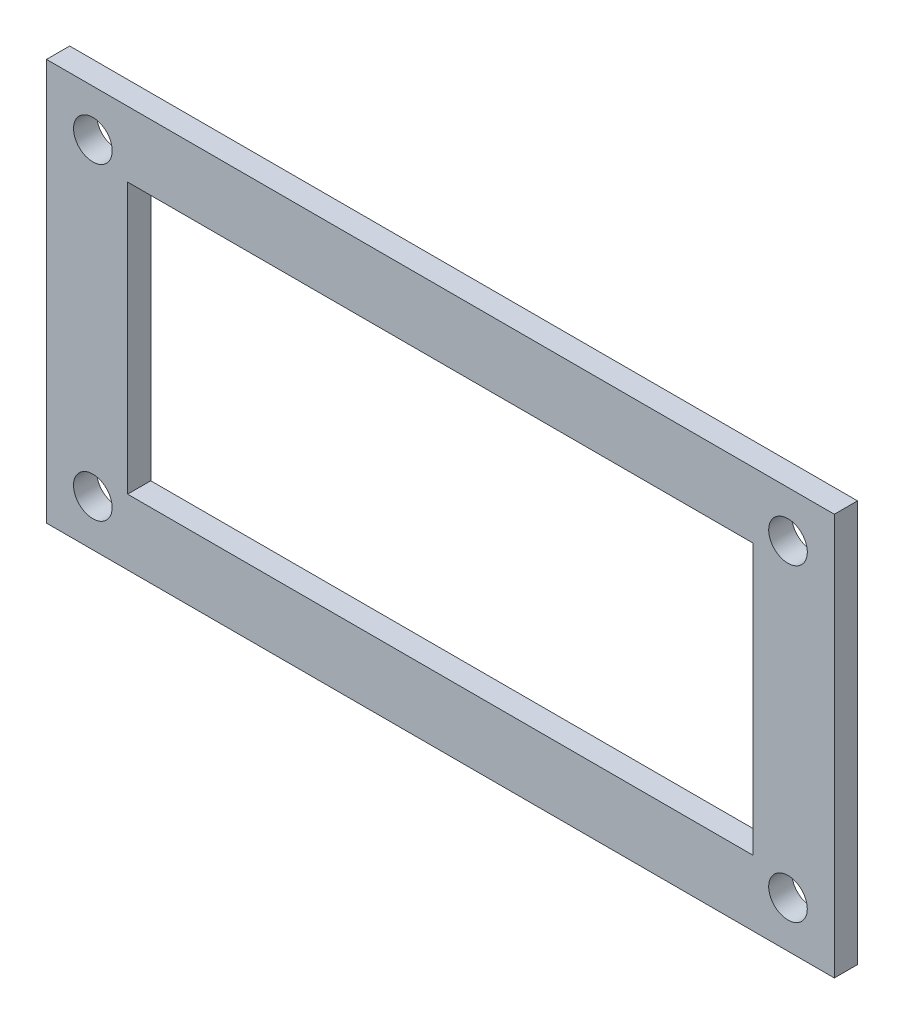
ISO-10303-21;
HEADER;
FILE_DESCRIPTION(('STEP AP214'),'2;1');
FILE_NAME('part.step','',(''),(''),'','','');
FILE_SCHEMA(('AUTOMOTIVE_DESIGN { 1 0 10303 214 1 1 1 1 }'));
ENDSEC;
DATA;
#1=APPLICATION_CONTEXT('core data for automotive mechanical design processes');
#2=APPLICATION_PROTOCOL_DEFINITION('international standard','automotive_design',2000,#1);
#3=PRODUCT_CONTEXT('',#1,'mechanical');
#4=PRODUCT('Part','Part','',(#3));
#5=PRODUCT_RELATED_PRODUCT_CATEGORY('part','',(#4));
#6=PRODUCT_DEFINITION_FORMATION('','',#4);
#7=PRODUCT_DEFINITION_CONTEXT('part definition',#1,'design');
#8=PRODUCT_DEFINITION('design','',#6,#7);
#9=PRODUCT_DEFINITION_SHAPE('','',#8);
#10=(LENGTH_UNIT() NAMED_UNIT(*) SI_UNIT(.MILLI.,.METRE.));
#11=(NAMED_UNIT(*) PLANE_ANGLE_UNIT() SI_UNIT($,.RADIAN.));
#12=(NAMED_UNIT(*) SI_UNIT($,.STERADIAN.) SOLID_ANGLE_UNIT());
#13=UNCERTAINTY_MEASURE_WITH_UNIT(LENGTH_MEASURE(1.E-05),#10,'distance_accuracy_value','');
#14=(GEOMETRIC_REPRESENTATION_CONTEXT(3) GLOBAL_UNCERTAINTY_ASSIGNED_CONTEXT((#13)) GLOBAL_UNIT_ASSIGNED_CONTEXT((#10,
#11,#12)) REPRESENTATION_CONTEXT('',''));
#15=CARTESIAN_POINT('',(0.,0.,0.));
#16=DIRECTION('',(0.,0.,1.));
#17=DIRECTION('',(1.,0.,0.));
#18=AXIS2_PLACEMENT_3D('',#15,#16,#17);
#19=CARTESIAN_POINT('',(0.,0.,3.));
#20=DIRECTION('',(0.,0.,-1.));
#21=DIRECTION('',(-1.,0.,0.));
#22=AXIS2_PLACEMENT_3D('',#19,#20,#21);
#23=PLANE('',#22);
#24=DIRECTION('',(0.,1.,0.));
#25=VECTOR('',#24,1.);
#26=CARTESIAN_POINT('',(51.,-26.,3.));
#27=LINE('',#26,#25);
#28=CARTESIAN_POINT('',(51.,-26.,3.));
#29=VERTEX_POINT('',#28);
#30=CARTESIAN_POINT('',(51.,26.,3.));
#31=VERTEX_POINT('',#30);
#32=EDGE_CURVE('E137',#29,#31,#27,.T.);
#33=ORIENTED_EDGE('',*,*,#32,.T.);
#34=DIRECTION('',(-1.,0.,0.));
#35=VECTOR('',#34,1.);
#36=CARTESIAN_POINT('',(-51.,26.,3.));
#37=LINE('',#36,#35);
#38=CARTESIAN_POINT('',(-51.,26.,3.));
#39=VERTEX_POINT('',#38);
#40=EDGE_CURVE('E140',#31,#39,#37,.T.);
#41=ORIENTED_EDGE('',*,*,#40,.T.);
#42=DIRECTION('',(0.,-1.,0.));
#43=VECTOR('',#42,1.);
#44=CARTESIAN_POINT('',(-51.,-26.,3.));
#45=LINE('',#44,#43);
#46=CARTESIAN_POINT('',(-51.,-26.,3.));
#47=VERTEX_POINT('',#46);
#48=EDGE_CURVE('E143',#39,#47,#45,.T.);
#49=ORIENTED_EDGE('',*,*,#48,.T.);
#50=DIRECTION('',(1.,0.,0.));
#51=VECTOR('',#50,1.);
#52=CARTESIAN_POINT('',(-51.,-26.,3.));
#53=LINE('',#52,#51);
#54=EDGE_CURVE('E145',#47,#29,#53,.T.);
#55=ORIENTED_EDGE('',*,*,#54,.T.);
#56=EDGE_LOOP('',(#33,#41,#49,#55));
#57=FACE_BOUND('',#56,.T.);
#58=DIRECTION('',(0.,1.,0.));
#59=VECTOR('',#58,1.);
#60=CARTESIAN_POINT('',(40.5,-17.5,3.));
#61=LINE('',#60,#59);
#62=CARTESIAN_POINT('',(40.5,-17.5,3.));
#63=VERTEX_POINT('',#62);
#64=CARTESIAN_POINT('',(40.5,17.5,3.));
#65=VERTEX_POINT('',#64);
#66=EDGE_CURVE('E98',#63,#65,#61,.T.);
#67=ORIENTED_EDGE('',*,*,#66,.F.);
#68=DIRECTION('',(1.,0.,0.));
#69=VECTOR('',#68,1.);
#70=CARTESIAN_POINT('',(-40.5,-17.5,3.));
#71=LINE('',#70,#69);
#72=CARTESIAN_POINT('',(-40.5,-17.5,3.));
#73=VERTEX_POINT('',#72);
#74=EDGE_CURVE('E121',#73,#63,#71,.T.);
#75=ORIENTED_EDGE('',*,*,#74,.F.);
#76=DIRECTION('',(0.,-1.,0.));
#77=VECTOR('',#76,1.);
#78=CARTESIAN_POINT('',(-40.5,-17.5,3.));
#79=LINE('',#78,#77);
#80=CARTESIAN_POINT('',(-40.5,17.5,3.));
#81=VERTEX_POINT('',#80);
#82=EDGE_CURVE('E119',#81,#73,#79,.T.);
#83=ORIENTED_EDGE('',*,*,#82,.F.);
#84=DIRECTION('',(-1.,0.,0.));
#85=VECTOR('',#84,1.);
#86=CARTESIAN_POINT('',(-40.5,17.5,3.));
#87=LINE('',#86,#85);
#88=EDGE_CURVE('E106',#65,#81,#87,.T.);
#89=ORIENTED_EDGE('',*,*,#88,.F.);
#90=EDGE_LOOP('',(#67,#75,#83,#89));
#91=FACE_BOUND('',#90,.T.);
#92=CARTESIAN_POINT('',(-45.,20.,3.));
#93=DIRECTION('',(0.,0.,1.));
#94=DIRECTION('',(1.,0.,0.));
#95=AXIS2_PLACEMENT_3D('',#92,#93,#94);
#96=CIRCLE('',#95,2.5);
#97=CARTESIAN_POINT('',(-42.5,20.,3.));
#98=VERTEX_POINT('',#97);
#99=EDGE_CURVE('E127',#98,#98,#96,.T.);
#100=ORIENTED_EDGE('',*,*,#99,.F.);
#101=EDGE_LOOP('',(#100));
#102=FACE_BOUND('',#101,.T.);
#103=CARTESIAN_POINT('',(-45.,-20.,3.));
#104=DIRECTION('',(0.,0.,1.));
#105=DIRECTION('',(-1.,0.,0.));
#106=AXIS2_PLACEMENT_3D('',#103,#104,#105);
#107=CIRCLE('',#106,2.49999999999999);
#108=CARTESIAN_POINT('',(-47.5,-20.,3.));
#109=VERTEX_POINT('',#108);
#110=EDGE_CURVE('E249',#109,#109,#107,.T.);
#111=ORIENTED_EDGE('',*,*,#110,.F.);
#112=EDGE_LOOP('',(#111));
#113=FACE_BOUND('',#112,.T.);
#114=CARTESIAN_POINT('',(45.,-20.,3.));
#115=DIRECTION('',(0.,0.,1.));
#116=DIRECTION('',(1.,0.,0.));
#117=AXIS2_PLACEMENT_3D('',#114,#115,#116);
#118=CIRCLE('',#117,2.49999999999999);
#119=CARTESIAN_POINT('',(47.5,-20.,3.));
#120=VERTEX_POINT('',#119);
#121=EDGE_CURVE('E243',#120,#120,#118,.T.);
#122=ORIENTED_EDGE('',*,*,#121,.F.);
#123=EDGE_LOOP('',(#122));
#124=FACE_BOUND('',#123,.T.);
#125=CARTESIAN_POINT('',(45.,20.,3.));
#126=DIRECTION('',(0.,0.,1.));
#127=DIRECTION('',(-1.,0.,0.));
#128=AXIS2_PLACEMENT_3D('',#125,#126,#127);
#129=CIRCLE('',#128,2.5);
#130=CARTESIAN_POINT('',(42.5,20.,3.));
#131=VERTEX_POINT('',#130);
#132=EDGE_CURVE('E234',#131,#131,#129,.T.);
#133=ORIENTED_EDGE('',*,*,#132,.F.);
#134=EDGE_LOOP('',(#133));
#135=FACE_BOUND('',#134,.T.);
#136=ADVANCED_FACE('F33',(#57,#91,#102,#113,#124,#135),#23,.F.);
#137=CARTESIAN_POINT('',(0.,0.,0.));
#138=DIRECTION('',(0.,0.,-1.));
#139=DIRECTION('',(-1.,0.,0.));
#140=AXIS2_PLACEMENT_3D('',#137,#138,#139);
#141=PLANE('',#140);
#142=CARTESIAN_POINT('',(45.,-20.,0.));
#143=DIRECTION('',(0.,0.,1.));
#144=DIRECTION('',(1.,0.,0.));
#145=AXIS2_PLACEMENT_3D('',#142,#143,#144);
#146=CIRCLE('',#145,2.49999999999999);
#147=CARTESIAN_POINT('',(47.5,-20.,0.));
#148=VERTEX_POINT('',#147);
#149=EDGE_CURVE('E240',#148,#148,#146,.T.);
#150=ORIENTED_EDGE('',*,*,#149,.T.);
#151=EDGE_LOOP('',(#150));
#152=FACE_BOUND('',#151,.T.);
#153=CARTESIAN_POINT('',(-45.,20.,0.));
#154=DIRECTION('',(0.,0.,1.));
#155=DIRECTION('',(1.,0.,0.));
#156=AXIS2_PLACEMENT_3D('',#153,#154,#155);
#157=CIRCLE('',#156,2.5);
#158=CARTESIAN_POINT('',(-42.5,20.,0.));
#159=VERTEX_POINT('',#158);
#160=EDGE_CURVE('E252',#159,#159,#157,.T.);
#161=ORIENTED_EDGE('',*,*,#160,.T.);
#162=EDGE_LOOP('',(#161));
#163=FACE_BOUND('',#162,.T.);
#164=DIRECTION('',(0.,1.,0.));
#165=VECTOR('',#164,1.);
#166=CARTESIAN_POINT('',(51.,-26.,0.));
#167=LINE('',#166,#165);
#168=CARTESIAN_POINT('',(51.,-26.,0.));
#169=VERTEX_POINT('',#168);
#170=CARTESIAN_POINT('',(51.,26.,0.));
#171=VERTEX_POINT('',#170);
#172=EDGE_CURVE('E114',#169,#171,#167,.T.);
#173=ORIENTED_EDGE('',*,*,#172,.F.);
#174=DIRECTION('',(1.,0.,0.));
#175=VECTOR('',#174,1.);
#176=CARTESIAN_POINT('',(-51.,-26.,0.));
#177=LINE('',#176,#175);
#178=CARTESIAN_POINT('',(-51.,-26.,0.));
#179=VERTEX_POINT('',#178);
#180=EDGE_CURVE('E141',#179,#169,#177,.T.);
#181=ORIENTED_EDGE('',*,*,#180,.F.);
#182=DIRECTION('',(0.,-1.,0.));
#183=VECTOR('',#182,1.);
#184=CARTESIAN_POINT('',(-51.,-26.,0.));
#185=LINE('',#184,#183);
#186=CARTESIAN_POINT('',(-51.,26.,0.));
#187=VERTEX_POINT('',#186);
#188=EDGE_CURVE('E152',#187,#179,#185,.T.);
#189=ORIENTED_EDGE('',*,*,#188,.F.);
#190=DIRECTION('',(-1.,0.,0.));
#191=VECTOR('',#190,1.);
#192=CARTESIAN_POINT('',(-51.,26.,0.));
#193=LINE('',#192,#191);
#194=EDGE_CURVE('E150',#171,#187,#193,.T.);
#195=ORIENTED_EDGE('',*,*,#194,.F.);
#196=EDGE_LOOP('',(#173,#181,#189,#195));
#197=FACE_BOUND('',#196,.T.);
#198=DIRECTION('',(1.,0.,0.));
#199=VECTOR('',#198,1.);
#200=CARTESIAN_POINT('',(-40.5,-17.5,0.));
#201=LINE('',#200,#199);
#202=CARTESIAN_POINT('',(-40.5,-17.5,0.));
#203=VERTEX_POINT('',#202);
#204=CARTESIAN_POINT('',(40.5,-17.5,0.));
#205=VERTEX_POINT('',#204);
#206=EDGE_CURVE('E107',#203,#205,#201,.T.);
#207=ORIENTED_EDGE('',*,*,#206,.T.);
#208=DIRECTION('',(0.,1.,0.));
#209=VECTOR('',#208,1.);
#210=CARTESIAN_POINT('',(40.5,-17.5,0.));
#211=LINE('',#210,#209);
#212=CARTESIAN_POINT('',(40.5,17.5,0.));
#213=VERTEX_POINT('',#212);
#214=EDGE_CURVE('E56',#205,#213,#211,.T.);
#215=ORIENTED_EDGE('',*,*,#214,.T.);
#216=DIRECTION('',(-1.,0.,0.));
#217=VECTOR('',#216,1.);
#218=CARTESIAN_POINT('',(-40.5,17.5,0.));
#219=LINE('',#218,#217);
#220=CARTESIAN_POINT('',(-40.5,17.5,0.));
#221=VERTEX_POINT('',#220);
#222=EDGE_CURVE('E113',#213,#221,#219,.T.);
#223=ORIENTED_EDGE('',*,*,#222,.T.);
#224=DIRECTION('',(0.,-1.,0.));
#225=VECTOR('',#224,1.);
#226=CARTESIAN_POINT('',(-40.5,-17.5,0.));
#227=LINE('',#226,#225);
#228=EDGE_CURVE('E129',#221,#203,#227,.T.);
#229=ORIENTED_EDGE('',*,*,#228,.T.);
#230=EDGE_LOOP('',(#207,#215,#223,#229));
#231=FACE_BOUND('',#230,.T.);
#232=CARTESIAN_POINT('',(-45.,-20.,0.));
#233=DIRECTION('',(0.,0.,1.));
#234=DIRECTION('',(-1.,0.,0.));
#235=AXIS2_PLACEMENT_3D('',#232,#233,#234);
#236=CIRCLE('',#235,2.49999999999999);
#237=CARTESIAN_POINT('',(-47.5,-20.,0.));
#238=VERTEX_POINT('',#237);
#239=EDGE_CURVE('E246',#238,#238,#236,.T.);
#240=ORIENTED_EDGE('',*,*,#239,.T.);
#241=EDGE_LOOP('',(#240));
#242=FACE_BOUND('',#241,.T.);
#243=CARTESIAN_POINT('',(45.,20.,0.));
#244=DIRECTION('',(0.,0.,1.));
#245=DIRECTION('',(-1.,0.,0.));
#246=AXIS2_PLACEMENT_3D('',#243,#244,#245);
#247=CIRCLE('',#246,2.5);
#248=CARTESIAN_POINT('',(42.5,20.,0.));
#249=VERTEX_POINT('',#248);
#250=EDGE_CURVE('E237',#249,#249,#247,.T.);
#251=ORIENTED_EDGE('',*,*,#250,.T.);
#252=EDGE_LOOP('',(#251));
#253=FACE_BOUND('',#252,.T.);
#254=ADVANCED_FACE('F170',(#152,#163,#197,#231,#242,#253),#141,.T.);
#255=CARTESIAN_POINT('',(51.,-26.,3.));
#256=DIRECTION('',(-1.,0.,0.));
#257=DIRECTION('',(0.,0.,1.));
#258=AXIS2_PLACEMENT_3D('',#255,#256,#257);
#259=PLANE('',#258);
#260=ORIENTED_EDGE('',*,*,#172,.T.);
#261=DIRECTION('',(0.,0.,-1.));
#262=VECTOR('',#261,1.);
#263=CARTESIAN_POINT('',(51.,26.,3.));
#264=LINE('',#263,#262);
#265=EDGE_CURVE('E11',#31,#171,#264,.T.);
#266=ORIENTED_EDGE('',*,*,#265,.F.);
#267=ORIENTED_EDGE('',*,*,#32,.F.);
#268=DIRECTION('',(0.,0.,-1.));
#269=VECTOR('',#268,1.);
#270=CARTESIAN_POINT('',(51.,-26.,3.));
#271=LINE('',#270,#269);
#272=EDGE_CURVE('E147',#29,#169,#271,.T.);
#273=ORIENTED_EDGE('',*,*,#272,.T.);
#274=EDGE_LOOP('',(#260,#266,#267,#273));
#275=FACE_BOUND('',#274,.T.);
#276=ADVANCED_FACE('F35',(#275),#259,.F.);
#277=CARTESIAN_POINT('',(-51.,26.,3.));
#278=DIRECTION('',(0.,-1.,0.));
#279=DIRECTION('',(0.,0.,-1.));
#280=AXIS2_PLACEMENT_3D('',#277,#278,#279);
#281=PLANE('',#280);
#282=ORIENTED_EDGE('',*,*,#194,.T.);
#283=DIRECTION('',(0.,0.,-1.));
#284=VECTOR('',#283,1.);
#285=CARTESIAN_POINT('',(-51.,26.,3.));
#286=LINE('',#285,#284);
#287=EDGE_CURVE('E41',#39,#187,#286,.T.);
#288=ORIENTED_EDGE('',*,*,#287,.F.);
#289=ORIENTED_EDGE('',*,*,#40,.F.);
#290=ORIENTED_EDGE('',*,*,#265,.T.);
#291=EDGE_LOOP('',(#282,#288,#289,#290));
#292=FACE_BOUND('',#291,.T.);
#293=ADVANCED_FACE('F180',(#292),#281,.F.);
#294=CARTESIAN_POINT('',(-51.,-26.,3.));
#295=DIRECTION('',(1.,0.,0.));
#296=DIRECTION('',(0.,0.,-1.));
#297=AXIS2_PLACEMENT_3D('',#294,#295,#296);
#298=PLANE('',#297);
#299=ORIENTED_EDGE('',*,*,#188,.T.);
#300=DIRECTION('',(0.,0.,-1.));
#301=VECTOR('',#300,1.);
#302=CARTESIAN_POINT('',(-51.,-26.,3.));
#303=LINE('',#302,#301);
#304=EDGE_CURVE('E157',#47,#179,#303,.T.);
#305=ORIENTED_EDGE('',*,*,#304,.F.);
#306=ORIENTED_EDGE('',*,*,#48,.F.);
#307=ORIENTED_EDGE('',*,*,#287,.T.);
#308=EDGE_LOOP('',(#299,#305,#306,#307));
#309=FACE_BOUND('',#308,.T.);
#310=ADVANCED_FACE('F164',(#309),#298,.F.);
#311=CARTESIAN_POINT('',(-51.,-26.,3.));
#312=DIRECTION('',(0.,1.,0.));
#313=DIRECTION('',(0.,0.,1.));
#314=AXIS2_PLACEMENT_3D('',#311,#312,#313);
#315=PLANE('',#314);
#316=ORIENTED_EDGE('',*,*,#180,.T.);
#317=ORIENTED_EDGE('',*,*,#272,.F.);
#318=ORIENTED_EDGE('',*,*,#54,.F.);
#319=ORIENTED_EDGE('',*,*,#304,.T.);
#320=EDGE_LOOP('',(#316,#317,#318,#319));
#321=FACE_BOUND('',#320,.T.);
#322=ADVANCED_FACE('F174',(#321),#315,.F.);
#323=CARTESIAN_POINT('',(40.5,-17.5,3.));
#324=DIRECTION('',(-1.,0.,0.));
#325=DIRECTION('',(0.,0.,1.));
#326=AXIS2_PLACEMENT_3D('',#323,#324,#325);
#327=PLANE('',#326);
#328=ORIENTED_EDGE('',*,*,#214,.F.);
#329=DIRECTION('',(0.,0.,-1.));
#330=VECTOR('',#329,1.);
#331=CARTESIAN_POINT('',(40.5,-17.5,3.));
#332=LINE('',#331,#330);
#333=EDGE_CURVE('E102',#63,#205,#332,.T.);
#334=ORIENTED_EDGE('',*,*,#333,.F.);
#335=ORIENTED_EDGE('',*,*,#66,.T.);
#336=DIRECTION('',(0.,0.,-1.));
#337=VECTOR('',#336,1.);
#338=CARTESIAN_POINT('',(40.5,17.5,3.));
#339=LINE('',#338,#337);
#340=EDGE_CURVE('E101',#65,#213,#339,.T.);
#341=ORIENTED_EDGE('',*,*,#340,.T.);
#342=EDGE_LOOP('',(#328,#334,#335,#341));
#343=FACE_BOUND('',#342,.T.);
#344=ADVANCED_FACE('F100',(#343),#327,.T.);
#345=CARTESIAN_POINT('',(-40.5,17.5,3.));
#346=DIRECTION('',(0.,-1.,0.));
#347=DIRECTION('',(0.,0.,-1.));
#348=AXIS2_PLACEMENT_3D('',#345,#346,#347);
#349=PLANE('',#348);
#350=ORIENTED_EDGE('',*,*,#222,.F.);
#351=ORIENTED_EDGE('',*,*,#340,.F.);
#352=ORIENTED_EDGE('',*,*,#88,.T.);
#353=DIRECTION('',(0.,0.,-1.));
#354=VECTOR('',#353,1.);
#355=CARTESIAN_POINT('',(-40.5,17.5,3.));
#356=LINE('',#355,#354);
#357=EDGE_CURVE('E115',#81,#221,#356,.T.);
#358=ORIENTED_EDGE('',*,*,#357,.T.);
#359=EDGE_LOOP('',(#350,#351,#352,#358));
#360=FACE_BOUND('',#359,.T.);
#361=ADVANCED_FACE('F110',(#360),#349,.T.);
#362=CARTESIAN_POINT('',(-40.5,-17.5,3.));
#363=DIRECTION('',(1.,0.,0.));
#364=DIRECTION('',(0.,0.,-1.));
#365=AXIS2_PLACEMENT_3D('',#362,#363,#364);
#366=PLANE('',#365);
#367=ORIENTED_EDGE('',*,*,#228,.F.);
#368=ORIENTED_EDGE('',*,*,#357,.F.);
#369=ORIENTED_EDGE('',*,*,#82,.T.);
#370=DIRECTION('',(0.,0.,-1.));
#371=VECTOR('',#370,1.);
#372=CARTESIAN_POINT('',(-40.5,-17.5,3.));
#373=LINE('',#372,#371);
#374=EDGE_CURVE('E48',#73,#203,#373,.T.);
#375=ORIENTED_EDGE('',*,*,#374,.T.);
#376=EDGE_LOOP('',(#367,#368,#369,#375));
#377=FACE_BOUND('',#376,.T.);
#378=ADVANCED_FACE('F204',(#377),#366,.T.);
#379=CARTESIAN_POINT('',(-40.5,-17.5,3.));
#380=DIRECTION('',(0.,1.,0.));
#381=DIRECTION('',(0.,0.,1.));
#382=AXIS2_PLACEMENT_3D('',#379,#380,#381);
#383=PLANE('',#382);
#384=ORIENTED_EDGE('',*,*,#206,.F.);
#385=ORIENTED_EDGE('',*,*,#374,.F.);
#386=ORIENTED_EDGE('',*,*,#74,.T.);
#387=ORIENTED_EDGE('',*,*,#333,.T.);
#388=EDGE_LOOP('',(#384,#385,#386,#387));
#389=FACE_BOUND('',#388,.T.);
#390=ADVANCED_FACE('F208',(#389),#383,.T.);
#391=CARTESIAN_POINT('',(-45.,20.,3.));
#392=DIRECTION('',(0.,0.,-1.));
#393=DIRECTION('',(-1.,0.,0.));
#394=AXIS2_PLACEMENT_3D('',#391,#392,#393);
#395=CYLINDRICAL_SURFACE('',#394,2.5);
#396=ORIENTED_EDGE('',*,*,#99,.T.);
#397=EDGE_LOOP('',(#396));
#398=FACE_BOUND('',#397,.T.);
#399=ORIENTED_EDGE('',*,*,#160,.F.);
#400=EDGE_LOOP('',(#399));
#401=FACE_BOUND('',#400,.T.);
#402=ADVANCED_FACE('F214',(#398,#401),#395,.F.);
#403=CARTESIAN_POINT('',(-45.,-20.,3.));
#404=DIRECTION('',(0.,0.,-1.));
#405=DIRECTION('',(-1.,0.,0.));
#406=AXIS2_PLACEMENT_3D('',#403,#404,#405);
#407=CYLINDRICAL_SURFACE('',#406,2.49999999999999);
#408=ORIENTED_EDGE('',*,*,#110,.T.);
#409=EDGE_LOOP('',(#408));
#410=FACE_BOUND('',#409,.T.);
#411=ORIENTED_EDGE('',*,*,#239,.F.);
#412=EDGE_LOOP('',(#411));
#413=FACE_BOUND('',#412,.T.);
#414=ADVANCED_FACE('F217',(#410,#413),#407,.F.);
#415=CARTESIAN_POINT('',(45.,-20.,3.));
#416=DIRECTION('',(0.,0.,-1.));
#417=DIRECTION('',(-1.,0.,0.));
#418=AXIS2_PLACEMENT_3D('',#415,#416,#417);
#419=CYLINDRICAL_SURFACE('',#418,2.49999999999999);
#420=ORIENTED_EDGE('',*,*,#121,.T.);
#421=EDGE_LOOP('',(#420));
#422=FACE_BOUND('',#421,.T.);
#423=ORIENTED_EDGE('',*,*,#149,.F.);
#424=EDGE_LOOP('',(#423));
#425=FACE_BOUND('',#424,.T.);
#426=ADVANCED_FACE('F221',(#422,#425),#419,.F.);
#427=CARTESIAN_POINT('',(45.,20.,3.));
#428=DIRECTION('',(0.,0.,-1.));
#429=DIRECTION('',(-1.,0.,0.));
#430=AXIS2_PLACEMENT_3D('',#427,#428,#429);
#431=CYLINDRICAL_SURFACE('',#430,2.5);
#432=ORIENTED_EDGE('',*,*,#132,.T.);
#433=EDGE_LOOP('',(#432));
#434=FACE_BOUND('',#433,.T.);
#435=ORIENTED_EDGE('',*,*,#250,.F.);
#436=EDGE_LOOP('',(#435));
#437=FACE_BOUND('',#436,.T.);
#438=ADVANCED_FACE('F225',(#434,#437),#431,.F.);
#439=CLOSED_SHELL('',(#136,#254,#276,#293,#310,#322,#344,#361,#378,#390,#402,#414,#426,#438));
#440=MANIFOLD_SOLID_BREP('B2',#439);
#441=ADVANCED_BREP_SHAPE_REPRESENTATION('',(#18,#440),#14);
#442=SHAPE_DEFINITION_REPRESENTATION(#9,#441);
ENDSEC;
END-ISO-10303-21;
